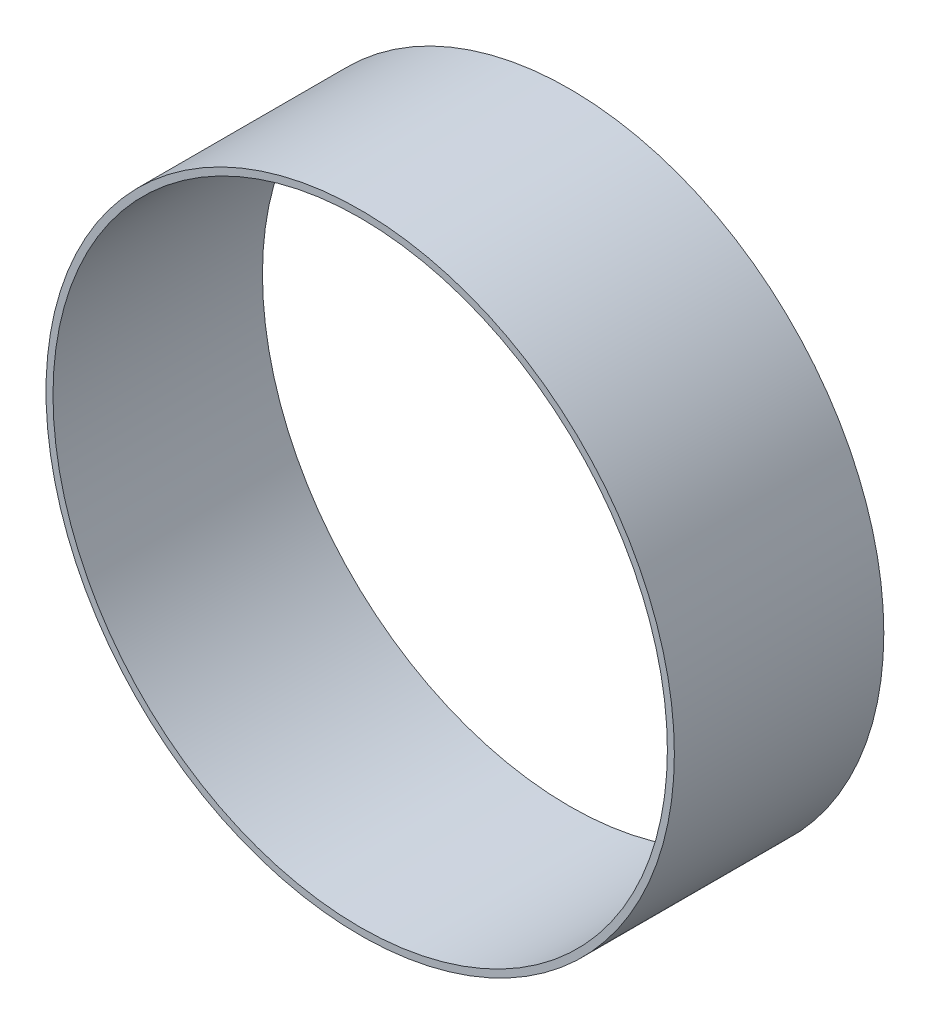
ISO-10303-21;
HEADER;
FILE_DESCRIPTION(('STEP AP214'),'2;1');
FILE_NAME('part.step','',(''),(''),'','','');
FILE_SCHEMA(('AUTOMOTIVE_DESIGN { 1 0 10303 214 1 1 1 1 }'));
ENDSEC;
DATA;
#1=APPLICATION_CONTEXT('core data for automotive mechanical design processes');
#2=APPLICATION_PROTOCOL_DEFINITION('international standard','automotive_design',2000,#1);
#3=PRODUCT_CONTEXT('',#1,'mechanical');
#4=PRODUCT('Part','Part','',(#3));
#5=PRODUCT_RELATED_PRODUCT_CATEGORY('part','',(#4));
#6=PRODUCT_DEFINITION_FORMATION('','',#4);
#7=PRODUCT_DEFINITION_CONTEXT('part definition',#1,'design');
#8=PRODUCT_DEFINITION('design','',#6,#7);
#9=PRODUCT_DEFINITION_SHAPE('','',#8);
#10=(LENGTH_UNIT() NAMED_UNIT(*) SI_UNIT(.MILLI.,.METRE.));
#11=(NAMED_UNIT(*) PLANE_ANGLE_UNIT() SI_UNIT($,.RADIAN.));
#12=(NAMED_UNIT(*) SI_UNIT($,.STERADIAN.) SOLID_ANGLE_UNIT());
#13=UNCERTAINTY_MEASURE_WITH_UNIT(LENGTH_MEASURE(1.E-05),#10,'distance_accuracy_value','');
#14=(GEOMETRIC_REPRESENTATION_CONTEXT(3) GLOBAL_UNCERTAINTY_ASSIGNED_CONTEXT((#13)) GLOBAL_UNIT_ASSIGNED_CONTEXT((#10,
#11,#12)) REPRESENTATION_CONTEXT('',''));
#15=CARTESIAN_POINT('',(0.,0.,0.));
#16=DIRECTION('',(0.,0.,1.));
#17=DIRECTION('',(1.,0.,0.));
#18=AXIS2_PLACEMENT_3D('',#15,#16,#17);
#19=CARTESIAN_POINT('',(0.,0.,95.25));
#20=DIRECTION('',(0.,0.,1.));
#21=DIRECTION('',(1.,0.,0.));
#22=AXIS2_PLACEMENT_3D('',#19,#20,#21);
#23=PLANE('',#22);
#24=CARTESIAN_POINT('',(0.,0.,95.25));
#25=DIRECTION('',(0.,0.,1.));
#26=DIRECTION('',(1.,0.,0.));
#27=AXIS2_PLACEMENT_3D('',#24,#25,#26);
#28=CIRCLE('',#27,142.875);
#29=CARTESIAN_POINT('',(142.875,0.,95.25));
#30=VERTEX_POINT('',#29);
#31=EDGE_CURVE('E10',#30,#30,#28,.T.);
#32=ORIENTED_EDGE('',*,*,#31,.T.);
#33=EDGE_LOOP('',(#32));
#34=FACE_BOUND('',#33,.T.);
#35=CARTESIAN_POINT('',(0.,0.,95.25));
#36=DIRECTION('',(0.,0.,1.));
#37=DIRECTION('',(1.,0.,0.));
#38=AXIS2_PLACEMENT_3D('',#35,#36,#37);
#39=CIRCLE('',#38,139.7);
#40=CARTESIAN_POINT('',(139.7,0.,95.25));
#41=VERTEX_POINT('',#40);
#42=EDGE_CURVE('E42',#41,#41,#39,.T.);
#43=ORIENTED_EDGE('',*,*,#42,.F.);
#44=EDGE_LOOP('',(#43));
#45=FACE_BOUND('',#44,.T.);
#46=ADVANCED_FACE('F31',(#34,#45),#23,.T.);
#47=CARTESIAN_POINT('',(0.,0.,0.));
#48=DIRECTION('',(0.,0.,1.));
#49=DIRECTION('',(1.,0.,0.));
#50=AXIS2_PLACEMENT_3D('',#47,#48,#49);
#51=PLANE('',#50);
#52=CARTESIAN_POINT('',(0.,0.,0.));
#53=DIRECTION('',(0.,0.,1.));
#54=DIRECTION('',(1.,0.,0.));
#55=AXIS2_PLACEMENT_3D('',#52,#53,#54);
#56=CIRCLE('',#55,142.875);
#57=CARTESIAN_POINT('',(142.875,0.,0.));
#58=VERTEX_POINT('',#57);
#59=EDGE_CURVE('E35',#58,#58,#56,.T.);
#60=ORIENTED_EDGE('',*,*,#59,.F.);
#61=EDGE_LOOP('',(#60));
#62=FACE_BOUND('',#61,.T.);
#63=CARTESIAN_POINT('',(0.,0.,0.));
#64=DIRECTION('',(0.,0.,1.));
#65=DIRECTION('',(1.,0.,0.));
#66=AXIS2_PLACEMENT_3D('',#63,#64,#65);
#67=CIRCLE('',#66,139.7);
#68=CARTESIAN_POINT('',(139.7,0.,0.));
#69=VERTEX_POINT('',#68);
#70=EDGE_CURVE('E44',#69,#69,#67,.T.);
#71=ORIENTED_EDGE('',*,*,#70,.T.);
#72=EDGE_LOOP('',(#71));
#73=FACE_BOUND('',#72,.T.);
#74=ADVANCED_FACE('F54',(#62,#73),#51,.F.);
#75=CARTESIAN_POINT('',(0.,0.,95.25));
#76=DIRECTION('',(0.,0.,-1.));
#77=DIRECTION('',(-1.,0.,0.));
#78=AXIS2_PLACEMENT_3D('',#75,#76,#77);
#79=CYLINDRICAL_SURFACE('',#78,142.875);
#80=ORIENTED_EDGE('',*,*,#31,.F.);
#81=EDGE_LOOP('',(#80));
#82=FACE_BOUND('',#81,.T.);
#83=ORIENTED_EDGE('',*,*,#59,.T.);
#84=EDGE_LOOP('',(#83));
#85=FACE_BOUND('',#84,.T.);
#86=ADVANCED_FACE('F33',(#82,#85),#79,.T.);
#87=CARTESIAN_POINT('',(0.,0.,95.25));
#88=DIRECTION('',(0.,0.,-1.));
#89=DIRECTION('',(-1.,0.,0.));
#90=AXIS2_PLACEMENT_3D('',#87,#88,#89);
#91=CYLINDRICAL_SURFACE('',#90,139.7);
#92=ORIENTED_EDGE('',*,*,#42,.T.);
#93=EDGE_LOOP('',(#92));
#94=FACE_BOUND('',#93,.T.);
#95=ORIENTED_EDGE('',*,*,#70,.F.);
#96=EDGE_LOOP('',(#95));
#97=FACE_BOUND('',#96,.T.);
#98=ADVANCED_FACE('F50',(#94,#97),#91,.F.);
#99=CLOSED_SHELL('',(#46,#74,#86,#98));
#100=MANIFOLD_SOLID_BREP('B2',#99);
#101=ADVANCED_BREP_SHAPE_REPRESENTATION('',(#18,#100),#14);
#102=SHAPE_DEFINITION_REPRESENTATION(#9,#101);
ENDSEC;
END-ISO-10303-21;
